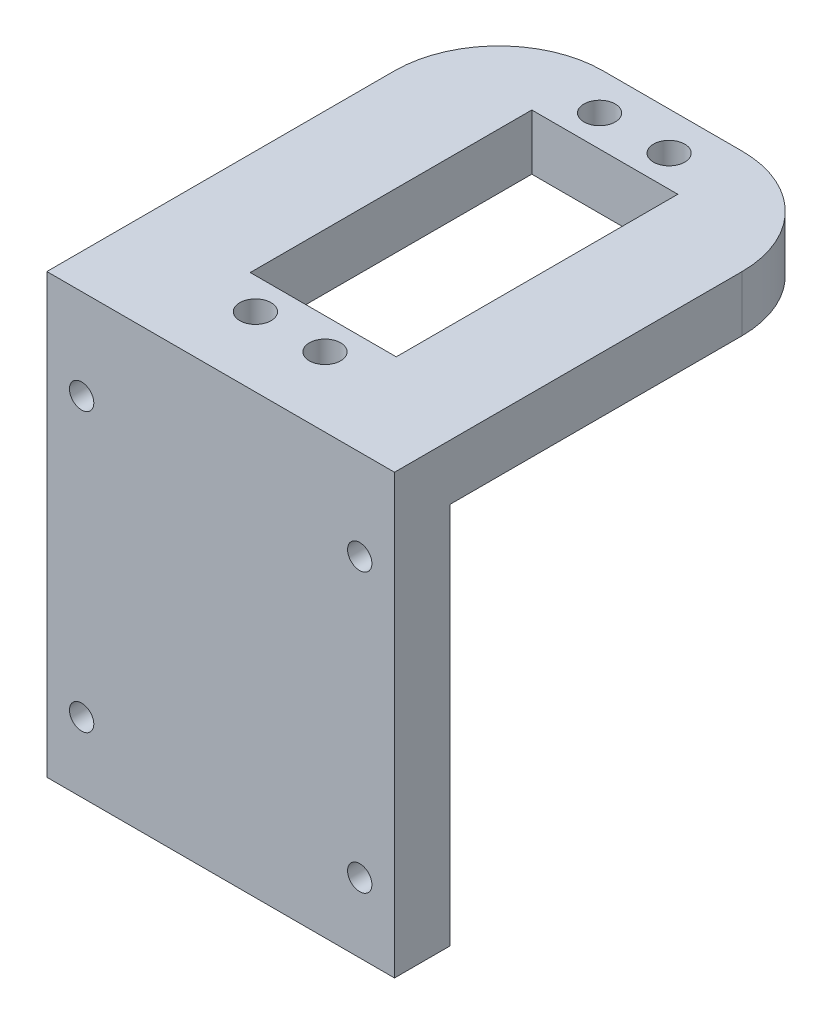
ISO-10303-21;
HEADER;
FILE_DESCRIPTION(('STEP AP214'),'2;1');
FILE_NAME('part.step','',(''),(''),'','','');
FILE_SCHEMA(('AUTOMOTIVE_DESIGN { 1 0 10303 214 1 1 1 1 }'));
ENDSEC;
DATA;
#1=APPLICATION_CONTEXT('core data for automotive mechanical design processes');
#2=APPLICATION_PROTOCOL_DEFINITION('international standard','automotive_design',2000,#1);
#3=PRODUCT_CONTEXT('',#1,'mechanical');
#4=PRODUCT('Part','Part','',(#3));
#5=PRODUCT_RELATED_PRODUCT_CATEGORY('part','',(#4));
#6=PRODUCT_DEFINITION_FORMATION('','',#4);
#7=PRODUCT_DEFINITION_CONTEXT('part definition',#1,'design');
#8=PRODUCT_DEFINITION('design','',#6,#7);
#9=PRODUCT_DEFINITION_SHAPE('','',#8);
#10=(LENGTH_UNIT() NAMED_UNIT(*) SI_UNIT(.MILLI.,.METRE.));
#11=(NAMED_UNIT(*) PLANE_ANGLE_UNIT() SI_UNIT($,.RADIAN.));
#12=(NAMED_UNIT(*) SI_UNIT($,.STERADIAN.) SOLID_ANGLE_UNIT());
#13=UNCERTAINTY_MEASURE_WITH_UNIT(LENGTH_MEASURE(1.E-05),#10,'distance_accuracy_value','');
#14=(GEOMETRIC_REPRESENTATION_CONTEXT(3) GLOBAL_UNCERTAINTY_ASSIGNED_CONTEXT((#13)) GLOBAL_UNIT_ASSIGNED_CONTEXT((#10,
#11,#12)) REPRESENTATION_CONTEXT('',''));
#15=CARTESIAN_POINT('',(0.,0.,0.));
#16=DIRECTION('',(0.,0.,1.));
#17=DIRECTION('',(1.,0.,0.));
#18=AXIS2_PLACEMENT_3D('',#15,#16,#17);
#19=CARTESIAN_POINT('',(20.,-5.,29.5));
#20=DIRECTION('',(0.,0.,-1.));
#21=DIRECTION('',(-1.,0.,0.));
#22=AXIS2_PLACEMENT_3D('',#19,#20,#21);
#23=CYLINDRICAL_SURFACE('',#22,1.75);
#24=CARTESIAN_POINT('',(20.,-5.,27.5));
#25=DIRECTION('',(0.,0.,-1.));
#26=DIRECTION('',(-1.,0.,0.));
#27=AXIS2_PLACEMENT_3D('',#24,#25,#26);
#28=CIRCLE('',#27,1.75);
#29=CARTESIAN_POINT('',(18.25,-5.,27.5));
#30=VERTEX_POINT('',#29);
#31=EDGE_CURVE('E270',#30,#30,#28,.T.);
#32=ORIENTED_EDGE('',*,*,#31,.F.);
#33=EDGE_LOOP('',(#32));
#34=FACE_BOUND('',#33,.T.);
#35=CARTESIAN_POINT('',(20.,-5.,22.5));
#36=DIRECTION('',(0.,0.,-1.));
#37=DIRECTION('',(-1.,0.,0.));
#38=AXIS2_PLACEMENT_3D('',#35,#36,#37);
#39=CIRCLE('',#38,1.75);
#40=CARTESIAN_POINT('',(18.25,-5.,22.5));
#41=VERTEX_POINT('',#40);
#42=EDGE_CURVE('E267',#41,#41,#39,.F.);
#43=ORIENTED_EDGE('',*,*,#42,.F.);
#44=EDGE_LOOP('',(#43));
#45=FACE_BOUND('',#44,.T.);
#46=ADVANCED_FACE('F44',(#34,#45),#23,.F.);
#47=CARTESIAN_POINT('',(-20.,-45.,29.5));
#48=DIRECTION('',(0.,0.,-1.));
#49=DIRECTION('',(-1.,0.,0.));
#50=AXIS2_PLACEMENT_3D('',#47,#48,#49);
#51=CYLINDRICAL_SURFACE('',#50,1.75);
#52=CARTESIAN_POINT('',(-20.,-45.,27.5));
#53=DIRECTION('',(0.,0.,-1.));
#54=DIRECTION('',(-1.,0.,0.));
#55=AXIS2_PLACEMENT_3D('',#52,#53,#54);
#56=CIRCLE('',#55,1.75);
#57=CARTESIAN_POINT('',(-21.75,-45.,27.5));
#58=VERTEX_POINT('',#57);
#59=EDGE_CURVE('E275',#58,#58,#56,.T.);
#60=ORIENTED_EDGE('',*,*,#59,.F.);
#61=EDGE_LOOP('',(#60));
#62=FACE_BOUND('',#61,.T.);
#63=CARTESIAN_POINT('',(-20.,-45.,22.5));
#64=DIRECTION('',(0.,0.,-1.));
#65=DIRECTION('',(-1.,0.,0.));
#66=AXIS2_PLACEMENT_3D('',#63,#64,#65);
#67=CIRCLE('',#66,1.75);
#68=CARTESIAN_POINT('',(-21.75,-45.,22.5));
#69=VERTEX_POINT('',#68);
#70=EDGE_CURVE('E264',#69,#69,#67,.F.);
#71=ORIENTED_EDGE('',*,*,#70,.F.);
#72=EDGE_LOOP('',(#71));
#73=FACE_BOUND('',#72,.T.);
#74=ADVANCED_FACE('F337',(#62,#73),#51,.F.);
#75=CARTESIAN_POINT('',(20.,-45.,29.5));
#76=DIRECTION('',(0.,0.,-1.));
#77=DIRECTION('',(-1.,0.,0.));
#78=AXIS2_PLACEMENT_3D('',#75,#76,#77);
#79=CYLINDRICAL_SURFACE('',#78,1.75);
#80=CARTESIAN_POINT('',(20.,-45.,27.5));
#81=DIRECTION('',(0.,0.,-1.));
#82=DIRECTION('',(-1.,0.,0.));
#83=AXIS2_PLACEMENT_3D('',#80,#81,#82);
#84=CIRCLE('',#83,1.75);
#85=CARTESIAN_POINT('',(18.25,-45.,27.5));
#86=VERTEX_POINT('',#85);
#87=EDGE_CURVE('E281',#86,#86,#84,.T.);
#88=ORIENTED_EDGE('',*,*,#87,.F.);
#89=EDGE_LOOP('',(#88));
#90=FACE_BOUND('',#89,.T.);
#91=CARTESIAN_POINT('',(20.,-45.,22.5));
#92=DIRECTION('',(0.,0.,-1.));
#93=DIRECTION('',(-1.,0.,0.));
#94=AXIS2_PLACEMENT_3D('',#91,#92,#93);
#95=CIRCLE('',#94,1.75);
#96=CARTESIAN_POINT('',(18.25,-45.,22.5));
#97=VERTEX_POINT('',#96);
#98=EDGE_CURVE('E259',#97,#97,#95,.F.);
#99=ORIENTED_EDGE('',*,*,#98,.F.);
#100=EDGE_LOOP('',(#99));
#101=FACE_BOUND('',#100,.T.);
#102=ADVANCED_FACE('F344',(#90,#101),#79,.F.);
#103=CARTESIAN_POINT('',(-20.,-5.,29.5));
#104=DIRECTION('',(0.,0.,-1.));
#105=DIRECTION('',(-1.,0.,0.));
#106=AXIS2_PLACEMENT_3D('',#103,#104,#105);
#107=CYLINDRICAL_SURFACE('',#106,1.75);
#108=CARTESIAN_POINT('',(-20.,-5.,27.5));
#109=DIRECTION('',(0.,0.,-1.));
#110=DIRECTION('',(-1.,0.,0.));
#111=AXIS2_PLACEMENT_3D('',#108,#109,#110);
#112=CIRCLE('',#111,1.75);
#113=CARTESIAN_POINT('',(-21.75,-5.,27.5));
#114=VERTEX_POINT('',#113);
#115=EDGE_CURVE('E290',#114,#114,#112,.T.);
#116=ORIENTED_EDGE('',*,*,#115,.F.);
#117=EDGE_LOOP('',(#116));
#118=FACE_BOUND('',#117,.T.);
#119=CARTESIAN_POINT('',(-20.,-5.,22.5));
#120=DIRECTION('',(0.,0.,-1.));
#121=DIRECTION('',(-1.,0.,0.));
#122=AXIS2_PLACEMENT_3D('',#119,#120,#121);
#123=CIRCLE('',#122,1.75);
#124=CARTESIAN_POINT('',(-21.75,-5.,22.5));
#125=VERTEX_POINT('',#124);
#126=EDGE_CURVE('E255',#125,#125,#123,.F.);
#127=ORIENTED_EDGE('',*,*,#126,.F.);
#128=EDGE_LOOP('',(#127));
#129=FACE_BOUND('',#128,.T.);
#130=ADVANCED_FACE('F364',(#118,#129),#107,.F.);
#131=CARTESIAN_POINT('',(0.,0.,0.));
#132=DIRECTION('',(0.,1.,0.));
#133=DIRECTION('',(0.,0.,1.));
#134=AXIS2_PLACEMENT_3D('',#131,#132,#133);
#135=PLANE('',#134);
#136=CARTESIAN_POINT('',(5.,0.,-32.));
#137=DIRECTION('',(0.,1.,0.));
#138=DIRECTION('',(0.,0.,1.));
#139=AXIS2_PLACEMENT_3D('',#136,#137,#138);
#140=CIRCLE('',#139,2.25);
#141=CARTESIAN_POINT('',(5.,0.,-29.75));
#142=VERTEX_POINT('',#141);
#143=EDGE_CURVE('E650',#142,#142,#140,.T.);
#144=ORIENTED_EDGE('',*,*,#143,.T.);
#145=EDGE_LOOP('',(#144));
#146=FACE_BOUND('',#145,.T.);
#147=CARTESIAN_POINT('',(-5.,0.,-32.));
#148=DIRECTION('',(0.,1.,0.));
#149=DIRECTION('',(0.,0.,1.));
#150=AXIS2_PLACEMENT_3D('',#147,#148,#149);
#151=CIRCLE('',#150,2.25);
#152=CARTESIAN_POINT('',(-5.,0.,-29.75));
#153=VERTEX_POINT('',#152);
#154=EDGE_CURVE('E653',#153,#153,#151,.T.);
#155=ORIENTED_EDGE('',*,*,#154,.T.);
#156=EDGE_LOOP('',(#155));
#157=FACE_BOUND('',#156,.T.);
#158=DIRECTION('',(-1.,0.,0.));
#159=VECTOR('',#158,1.);
#160=CARTESIAN_POINT('',(0.,0.,-27.5));
#161=LINE('',#160,#159);
#162=CARTESIAN_POINT('',(10.75,0.,-27.5));
#163=VERTEX_POINT('',#162);
#164=CARTESIAN_POINT('',(-10.25,0.,-27.5));
#165=VERTEX_POINT('',#164);
#166=EDGE_CURVE('E696',#163,#165,#161,.T.);
#167=ORIENTED_EDGE('',*,*,#166,.T.);
#168=DIRECTION('',(0.,0.,1.));
#169=VECTOR('',#168,1.);
#170=CARTESIAN_POINT('',(-10.25,0.,0.));
#171=LINE('',#170,#169);
#172=CARTESIAN_POINT('',(-10.25,0.,13.));
#173=VERTEX_POINT('',#172);
#174=EDGE_CURVE('E700',#165,#173,#171,.T.);
#175=ORIENTED_EDGE('',*,*,#174,.T.);
#176=DIRECTION('',(1.,0.,0.));
#177=VECTOR('',#176,1.);
#178=CARTESIAN_POINT('',(0.,0.,13.));
#179=LINE('',#178,#177);
#180=CARTESIAN_POINT('',(10.75,0.,13.));
#181=VERTEX_POINT('',#180);
#182=EDGE_CURVE('E679',#173,#181,#179,.T.);
#183=ORIENTED_EDGE('',*,*,#182,.T.);
#184=DIRECTION('',(0.,0.,-1.));
#185=VECTOR('',#184,1.);
#186=CARTESIAN_POINT('',(10.75,0.,0.));
#187=LINE('',#186,#185);
#188=EDGE_CURVE('E692',#181,#163,#187,.T.);
#189=ORIENTED_EDGE('',*,*,#188,.T.);
#190=EDGE_LOOP('',(#167,#175,#183,#189));
#191=FACE_BOUND('',#190,.T.);
#192=DIRECTION('',(0.,0.,1.));
#193=VECTOR('',#192,1.);
#194=CARTESIAN_POINT('',(-25.,0.,-37.5));
#195=LINE('',#194,#193);
#196=CARTESIAN_POINT('',(-25.,0.,-22.5));
#197=VERTEX_POINT('',#196);
#198=CARTESIAN_POINT('',(-25.,0.,19.5));
#199=VERTEX_POINT('',#198);
#200=EDGE_CURVE('E222',#197,#199,#195,.T.);
#201=ORIENTED_EDGE('',*,*,#200,.F.);
#202=CARTESIAN_POINT('',(-10.,0.,-22.5));
#203=DIRECTION('',(0.,1.,0.));
#204=DIRECTION('',(0.,0.,1.));
#205=AXIS2_PLACEMENT_3D('',#202,#203,#204);
#206=CIRCLE('',#205,15.);
#207=CARTESIAN_POINT('',(-10.,0.,-37.5));
#208=VERTEX_POINT('',#207);
#209=EDGE_CURVE('E67',#197,#208,#206,.F.);
#210=ORIENTED_EDGE('',*,*,#209,.T.);
#211=DIRECTION('',(-1.,0.,0.));
#212=VECTOR('',#211,1.);
#213=CARTESIAN_POINT('',(-25.,0.,-37.5));
#214=LINE('',#213,#212);
#215=CARTESIAN_POINT('',(9.99999999999999,0.,-37.5));
#216=VERTEX_POINT('',#215);
#217=EDGE_CURVE('E240',#216,#208,#214,.T.);
#218=ORIENTED_EDGE('',*,*,#217,.F.);
#219=CARTESIAN_POINT('',(9.99999999999999,0.,-22.5));
#220=DIRECTION('',(0.,1.,0.));
#221=DIRECTION('',(0.,0.,1.));
#222=AXIS2_PLACEMENT_3D('',#219,#220,#221);
#223=CIRCLE('',#222,15.);
#224=CARTESIAN_POINT('',(25.,0.,-22.5));
#225=VERTEX_POINT('',#224);
#226=EDGE_CURVE('E202',#216,#225,#223,.F.);
#227=ORIENTED_EDGE('',*,*,#226,.T.);
#228=DIRECTION('',(0.,0.,-1.));
#229=VECTOR('',#228,1.);
#230=CARTESIAN_POINT('',(25.,0.,-37.5));
#231=LINE('',#230,#229);
#232=CARTESIAN_POINT('',(25.,0.,19.5));
#233=VERTEX_POINT('',#232);
#234=EDGE_CURVE('E234',#233,#225,#231,.T.);
#235=ORIENTED_EDGE('',*,*,#234,.F.);
#236=DIRECTION('',(1.,0.,0.));
#237=VECTOR('',#236,1.);
#238=CARTESIAN_POINT('',(-25.,0.,19.5));
#239=LINE('',#238,#237);
#240=CARTESIAN_POINT('',(6.03077640640441,0.,19.5));
#241=VERTEX_POINT('',#240);
#242=EDGE_CURVE('E294',#241,#233,#239,.T.);
#243=ORIENTED_EDGE('',*,*,#242,.F.);
#244=CARTESIAN_POINT('',(5.,0.,17.5));
#245=DIRECTION('',(0.,1.,0.));
#246=DIRECTION('',(0.,0.,1.));
#247=AXIS2_PLACEMENT_3D('',#244,#245,#246);
#248=CIRCLE('',#247,2.25);
#249=CARTESIAN_POINT('',(3.96922359359559,0.,19.5));
#250=VERTEX_POINT('',#249);
#251=EDGE_CURVE('E767',#241,#250,#248,.T.);
#252=ORIENTED_EDGE('',*,*,#251,.T.);
#253=CARTESIAN_POINT('',(-3.9692235935956,0.,19.5));
#254=VERTEX_POINT('',#253);
#255=EDGE_CURVE('E181',#254,#250,#239,.T.);
#256=ORIENTED_EDGE('',*,*,#255,.F.);
#257=CARTESIAN_POINT('',(-5.,0.,17.5));
#258=DIRECTION('',(0.,1.,0.));
#259=DIRECTION('',(0.,0.,1.));
#260=AXIS2_PLACEMENT_3D('',#257,#258,#259);
#261=CIRCLE('',#260,2.25);
#262=CARTESIAN_POINT('',(-6.0307764064044,0.,19.5));
#263=VERTEX_POINT('',#262);
#264=EDGE_CURVE('E660',#254,#263,#261,.T.);
#265=ORIENTED_EDGE('',*,*,#264,.T.);
#266=EDGE_CURVE('E231',#199,#263,#239,.T.);
#267=ORIENTED_EDGE('',*,*,#266,.F.);
#268=EDGE_LOOP('',(#201,#210,#218,#227,#235,#243,#252,#256,#265,#267));
#269=FACE_BOUND('',#268,.T.);
#270=ADVANCED_FACE('F228',(#146,#157,#191,#269),#135,.F.);
#271=CARTESIAN_POINT('',(-25.,8.,-37.5));
#272=DIRECTION('',(1.,0.,0.));
#273=DIRECTION('',(0.,0.,-1.));
#274=AXIS2_PLACEMENT_3D('',#271,#272,#273);
#275=PLANE('',#274);
#276=DIRECTION('',(0.,0.,1.));
#277=VECTOR('',#276,1.);
#278=CARTESIAN_POINT('',(-25.,8.,-37.5));
#279=LINE('',#278,#277);
#280=CARTESIAN_POINT('',(-25.,8.,-22.5));
#281=VERTEX_POINT('',#280);
#282=CARTESIAN_POINT('',(-25.,8.,27.5));
#283=VERTEX_POINT('',#282);
#284=EDGE_CURVE('E225',#281,#283,#279,.T.);
#285=ORIENTED_EDGE('',*,*,#284,.F.);
#286=DIRECTION('',(0.,-1.,0.));
#287=VECTOR('',#286,1.);
#288=CARTESIAN_POINT('',(-25.,8.,-22.5));
#289=LINE('',#288,#287);
#290=EDGE_CURVE('E211',#281,#197,#289,.T.);
#291=ORIENTED_EDGE('',*,*,#290,.T.);
#292=ORIENTED_EDGE('',*,*,#200,.T.);
#293=DIRECTION('',(0.,1.,0.));
#294=VECTOR('',#293,1.);
#295=CARTESIAN_POINT('',(-25.,-55.,19.5));
#296=LINE('',#295,#294);
#297=CARTESIAN_POINT('',(-25.,-55.,19.5));
#298=VERTEX_POINT('',#297);
#299=EDGE_CURVE('E235',#298,#199,#296,.T.);
#300=ORIENTED_EDGE('',*,*,#299,.F.);
#301=DIRECTION('',(0.,0.,-1.));
#302=VECTOR('',#301,1.);
#303=CARTESIAN_POINT('',(-25.,-55.,27.5));
#304=LINE('',#303,#302);
#305=CARTESIAN_POINT('',(-25.,-55.,27.5));
#306=VERTEX_POINT('',#305);
#307=EDGE_CURVE('E295',#306,#298,#304,.T.);
#308=ORIENTED_EDGE('',*,*,#307,.F.);
#309=DIRECTION('',(0.,-1.,0.));
#310=VECTOR('',#309,1.);
#311=CARTESIAN_POINT('',(-25.,8.,27.5));
#312=LINE('',#311,#310);
#313=EDGE_CURVE('E167',#283,#306,#312,.T.);
#314=ORIENTED_EDGE('',*,*,#313,.F.);
#315=EDGE_LOOP('',(#285,#291,#292,#300,#308,#314));
#316=FACE_BOUND('',#315,.T.);
#317=ADVANCED_FACE('F220',(#316),#275,.F.);
#318=CARTESIAN_POINT('',(-25.,8.,27.5));
#319=DIRECTION('',(0.,0.,-1.));
#320=DIRECTION('',(-1.,0.,0.));
#321=AXIS2_PLACEMENT_3D('',#318,#319,#320);
#322=PLANE('',#321);
#323=ORIENTED_EDGE('',*,*,#115,.T.);
#324=EDGE_LOOP('',(#323));
#325=FACE_BOUND('',#324,.T.);
#326=ORIENTED_EDGE('',*,*,#87,.T.);
#327=EDGE_LOOP('',(#326));
#328=FACE_BOUND('',#327,.T.);
#329=ORIENTED_EDGE('',*,*,#59,.T.);
#330=EDGE_LOOP('',(#329));
#331=FACE_BOUND('',#330,.T.);
#332=ORIENTED_EDGE('',*,*,#31,.T.);
#333=EDGE_LOOP('',(#332));
#334=FACE_BOUND('',#333,.T.);
#335=ORIENTED_EDGE('',*,*,#313,.T.);
#336=DIRECTION('',(-1.,0.,0.));
#337=VECTOR('',#336,1.);
#338=CARTESIAN_POINT('',(-25.,-55.,27.5));
#339=LINE('',#338,#337);
#340=CARTESIAN_POINT('',(25.,-55.,27.5));
#341=VERTEX_POINT('',#340);
#342=EDGE_CURVE('E306',#341,#306,#339,.T.);
#343=ORIENTED_EDGE('',*,*,#342,.F.);
#344=DIRECTION('',(0.,-1.,0.));
#345=VECTOR('',#344,1.);
#346=CARTESIAN_POINT('',(25.,8.,27.5));
#347=LINE('',#346,#345);
#348=CARTESIAN_POINT('',(25.,8.,27.5));
#349=VERTEX_POINT('',#348);
#350=EDGE_CURVE('E250',#349,#341,#347,.T.);
#351=ORIENTED_EDGE('',*,*,#350,.F.);
#352=DIRECTION('',(1.,0.,0.));
#353=VECTOR('',#352,1.);
#354=CARTESIAN_POINT('',(-25.,8.,27.5));
#355=LINE('',#354,#353);
#356=EDGE_CURVE('E317',#283,#349,#355,.T.);
#357=ORIENTED_EDGE('',*,*,#356,.F.);
#358=EDGE_LOOP('',(#335,#343,#351,#357));
#359=FACE_BOUND('',#358,.T.);
#360=ADVANCED_FACE('F371',(#325,#328,#331,#334,#359),#322,.F.);
#361=CARTESIAN_POINT('',(25.,8.,-37.5));
#362=DIRECTION('',(-1.,0.,0.));
#363=DIRECTION('',(0.,0.,1.));
#364=AXIS2_PLACEMENT_3D('',#361,#362,#363);
#365=PLANE('',#364);
#366=ORIENTED_EDGE('',*,*,#234,.T.);
#367=DIRECTION('',(0.,-1.,0.));
#368=VECTOR('',#367,1.);
#369=CARTESIAN_POINT('',(25.,8.,-22.5));
#370=LINE('',#369,#368);
#371=CARTESIAN_POINT('',(25.,8.,-22.5));
#372=VERTEX_POINT('',#371);
#373=EDGE_CURVE('E205',#225,#372,#370,.F.);
#374=ORIENTED_EDGE('',*,*,#373,.T.);
#375=DIRECTION('',(0.,0.,-1.));
#376=VECTOR('',#375,1.);
#377=CARTESIAN_POINT('',(25.,8.,-37.5));
#378=LINE('',#377,#376);
#379=EDGE_CURVE('E319',#349,#372,#378,.T.);
#380=ORIENTED_EDGE('',*,*,#379,.F.);
#381=ORIENTED_EDGE('',*,*,#350,.T.);
#382=DIRECTION('',(0.,0.,1.));
#383=VECTOR('',#382,1.);
#384=CARTESIAN_POINT('',(25.,-55.,27.5));
#385=LINE('',#384,#383);
#386=CARTESIAN_POINT('',(25.,-55.,19.5));
#387=VERTEX_POINT('',#386);
#388=EDGE_CURVE('E302',#387,#341,#385,.T.);
#389=ORIENTED_EDGE('',*,*,#388,.F.);
#390=DIRECTION('',(0.,1.,0.));
#391=VECTOR('',#390,1.);
#392=CARTESIAN_POINT('',(25.,-55.,19.5));
#393=LINE('',#392,#391);
#394=EDGE_CURVE('E242',#387,#233,#393,.T.);
#395=ORIENTED_EDGE('',*,*,#394,.T.);
#396=EDGE_LOOP('',(#366,#374,#380,#381,#389,#395));
#397=FACE_BOUND('',#396,.T.);
#398=ADVANCED_FACE('F368',(#397),#365,.F.);
#399=CARTESIAN_POINT('',(-25.,8.,-37.5));
#400=DIRECTION('',(0.,0.,1.));
#401=DIRECTION('',(1.,0.,0.));
#402=AXIS2_PLACEMENT_3D('',#399,#400,#401);
#403=PLANE('',#402);
#404=ORIENTED_EDGE('',*,*,#217,.T.);
#405=DIRECTION('',(0.,-1.,0.));
#406=VECTOR('',#405,1.);
#407=CARTESIAN_POINT('',(-10.,8.,-37.5));
#408=LINE('',#407,#406);
#409=CARTESIAN_POINT('',(-10.,8.,-37.5));
#410=VERTEX_POINT('',#409);
#411=EDGE_CURVE('E53',#208,#410,#408,.F.);
#412=ORIENTED_EDGE('',*,*,#411,.T.);
#413=DIRECTION('',(-1.,0.,0.));
#414=VECTOR('',#413,1.);
#415=CARTESIAN_POINT('',(-25.,8.,-37.5));
#416=LINE('',#415,#414);
#417=CARTESIAN_POINT('',(9.99999999999999,8.,-37.5));
#418=VERTEX_POINT('',#417);
#419=EDGE_CURVE('E245',#418,#410,#416,.T.);
#420=ORIENTED_EDGE('',*,*,#419,.F.);
#421=DIRECTION('',(0.,-1.,0.));
#422=VECTOR('',#421,1.);
#423=CARTESIAN_POINT('',(9.99999999999999,8.,-37.5));
#424=LINE('',#423,#422);
#425=EDGE_CURVE('E198',#418,#216,#424,.T.);
#426=ORIENTED_EDGE('',*,*,#425,.T.);
#427=EDGE_LOOP('',(#404,#412,#420,#426));
#428=FACE_BOUND('',#427,.T.);
#429=ADVANCED_FACE('F360',(#428),#403,.F.);
#430=CARTESIAN_POINT('',(0.,8.,0.));
#431=DIRECTION('',(0.,1.,0.));
#432=DIRECTION('',(0.,0.,1.));
#433=AXIS2_PLACEMENT_3D('',#430,#431,#432);
#434=PLANE('',#433);
#435=CARTESIAN_POINT('',(5.,8.,-32.));
#436=DIRECTION('',(0.,1.,0.));
#437=DIRECTION('',(0.,0.,1.));
#438=AXIS2_PLACEMENT_3D('',#435,#436,#437);
#439=CIRCLE('',#438,2.25);
#440=CARTESIAN_POINT('',(5.,8.,-29.75));
#441=VERTEX_POINT('',#440);
#442=EDGE_CURVE('E647',#441,#441,#439,.T.);
#443=ORIENTED_EDGE('',*,*,#442,.F.);
#444=EDGE_LOOP('',(#443));
#445=FACE_BOUND('',#444,.T.);
#446=CARTESIAN_POINT('',(-5.,8.,17.5));
#447=DIRECTION('',(0.,1.,0.));
#448=DIRECTION('',(0.,0.,1.));
#449=AXIS2_PLACEMENT_3D('',#446,#447,#448);
#450=CIRCLE('',#449,2.25);
#451=CARTESIAN_POINT('',(-5.,8.,19.75));
#452=VERTEX_POINT('',#451);
#453=EDGE_CURVE('E777',#452,#452,#450,.T.);
#454=ORIENTED_EDGE('',*,*,#453,.F.);
#455=EDGE_LOOP('',(#454));
#456=FACE_BOUND('',#455,.T.);
#457=CARTESIAN_POINT('',(5.,8.,17.5));
#458=DIRECTION('',(0.,1.,0.));
#459=DIRECTION('',(0.,0.,1.));
#460=AXIS2_PLACEMENT_3D('',#457,#458,#459);
#461=CIRCLE('',#460,2.25);
#462=CARTESIAN_POINT('',(5.,8.,19.75));
#463=VERTEX_POINT('',#462);
#464=EDGE_CURVE('E174',#463,#463,#461,.T.);
#465=ORIENTED_EDGE('',*,*,#464,.F.);
#466=EDGE_LOOP('',(#465));
#467=FACE_BOUND('',#466,.T.);
#468=CARTESIAN_POINT('',(-5.,8.,-32.));
#469=DIRECTION('',(0.,1.,0.));
#470=DIRECTION('',(0.,0.,1.));
#471=AXIS2_PLACEMENT_3D('',#468,#469,#470);
#472=CIRCLE('',#471,2.25);
#473=CARTESIAN_POINT('',(-5.,8.,-29.75));
#474=VERTEX_POINT('',#473);
#475=EDGE_CURVE('E770',#474,#474,#472,.T.);
#476=ORIENTED_EDGE('',*,*,#475,.F.);
#477=EDGE_LOOP('',(#476));
#478=FACE_BOUND('',#477,.T.);
#479=DIRECTION('',(0.,0.,1.));
#480=VECTOR('',#479,1.);
#481=CARTESIAN_POINT('',(-10.25,8.,-27.5));
#482=LINE('',#481,#480);
#483=CARTESIAN_POINT('',(-10.25,8.,-27.5));
#484=VERTEX_POINT('',#483);
#485=CARTESIAN_POINT('',(-10.25,8.,13.));
#486=VERTEX_POINT('',#485);
#487=EDGE_CURVE('E652',#484,#486,#482,.T.);
#488=ORIENTED_EDGE('',*,*,#487,.F.);
#489=DIRECTION('',(-1.,0.,0.));
#490=VECTOR('',#489,1.);
#491=CARTESIAN_POINT('',(-10.25,8.,-27.5));
#492=LINE('',#491,#490);
#493=CARTESIAN_POINT('',(10.75,8.,-27.5));
#494=VERTEX_POINT('',#493);
#495=EDGE_CURVE('E671',#494,#484,#492,.T.);
#496=ORIENTED_EDGE('',*,*,#495,.F.);
#497=DIRECTION('',(0.,0.,-1.));
#498=VECTOR('',#497,1.);
#499=CARTESIAN_POINT('',(10.75,8.,-27.5));
#500=LINE('',#499,#498);
#501=CARTESIAN_POINT('',(10.75,8.,13.));
#502=VERTEX_POINT('',#501);
#503=EDGE_CURVE('E667',#502,#494,#500,.T.);
#504=ORIENTED_EDGE('',*,*,#503,.F.);
#505=DIRECTION('',(1.,0.,0.));
#506=VECTOR('',#505,1.);
#507=CARTESIAN_POINT('',(-10.25,8.,13.));
#508=LINE('',#507,#506);
#509=EDGE_CURVE('E657',#486,#502,#508,.T.);
#510=ORIENTED_EDGE('',*,*,#509,.F.);
#511=EDGE_LOOP('',(#488,#496,#504,#510));
#512=FACE_BOUND('',#511,.T.);
#513=ORIENTED_EDGE('',*,*,#419,.T.);
#514=CARTESIAN_POINT('',(-10.,8.,-22.5));
#515=DIRECTION('',(0.,1.,0.));
#516=DIRECTION('',(0.,0.,1.));
#517=AXIS2_PLACEMENT_3D('',#514,#515,#516);
#518=CIRCLE('',#517,15.);
#519=EDGE_CURVE('E11',#410,#281,#518,.T.);
#520=ORIENTED_EDGE('',*,*,#519,.T.);
#521=ORIENTED_EDGE('',*,*,#284,.T.);
#522=ORIENTED_EDGE('',*,*,#356,.T.);
#523=ORIENTED_EDGE('',*,*,#379,.T.);
#524=CARTESIAN_POINT('',(9.99999999999999,8.,-22.5));
#525=DIRECTION('',(0.,1.,0.));
#526=DIRECTION('',(0.,0.,1.));
#527=AXIS2_PLACEMENT_3D('',#524,#525,#526);
#528=CIRCLE('',#527,15.);
#529=EDGE_CURVE('E208',#372,#418,#528,.T.);
#530=ORIENTED_EDGE('',*,*,#529,.T.);
#531=EDGE_LOOP('',(#513,#520,#521,#522,#523,#530));
#532=FACE_BOUND('',#531,.T.);
#533=ADVANCED_FACE('F326',(#445,#456,#467,#478,#512,#532),#434,.T.);
#534=CARTESIAN_POINT('',(-25.,-55.,19.5));
#535=DIRECTION('',(0.,0.,1.));
#536=DIRECTION('',(1.,0.,0.));
#537=AXIS2_PLACEMENT_3D('',#534,#535,#536);
#538=PLANE('',#537);
#539=CARTESIAN_POINT('',(20.,-45.,19.5));
#540=DIRECTION('',(0.,0.,-1.));
#541=DIRECTION('',(-1.,0.,0.));
#542=AXIS2_PLACEMENT_3D('',#539,#540,#541);
#543=CIRCLE('',#542,3.5);
#544=CARTESIAN_POINT('',(16.5,-45.,19.5));
#545=VERTEX_POINT('',#544);
#546=EDGE_CURVE('E721',#545,#545,#543,.T.);
#547=ORIENTED_EDGE('',*,*,#546,.F.);
#548=EDGE_LOOP('',(#547));
#549=FACE_BOUND('',#548,.T.);
#550=CARTESIAN_POINT('',(-20.,-45.,19.5));
#551=DIRECTION('',(0.,0.,-1.));
#552=DIRECTION('',(-1.,0.,0.));
#553=AXIS2_PLACEMENT_3D('',#550,#551,#552);
#554=CIRCLE('',#553,3.5);
#555=CARTESIAN_POINT('',(-23.5,-45.,19.5));
#556=VERTEX_POINT('',#555);
#557=EDGE_CURVE('E713',#556,#556,#554,.T.);
#558=ORIENTED_EDGE('',*,*,#557,.F.);
#559=EDGE_LOOP('',(#558));
#560=FACE_BOUND('',#559,.T.);
#561=CARTESIAN_POINT('',(-20.,-5.,19.5));
#562=DIRECTION('',(0.,0.,-1.));
#563=DIRECTION('',(-1.,0.,0.));
#564=AXIS2_PLACEMENT_3D('',#561,#562,#563);
#565=CIRCLE('',#564,3.5);
#566=CARTESIAN_POINT('',(-23.5,-5.,19.5));
#567=VERTEX_POINT('',#566);
#568=EDGE_CURVE('E705',#567,#567,#565,.T.);
#569=ORIENTED_EDGE('',*,*,#568,.F.);
#570=EDGE_LOOP('',(#569));
#571=FACE_BOUND('',#570,.T.);
#572=CARTESIAN_POINT('',(20.,-5.,19.5));
#573=DIRECTION('',(0.,0.,-1.));
#574=DIRECTION('',(-1.,0.,0.));
#575=AXIS2_PLACEMENT_3D('',#572,#573,#574);
#576=CIRCLE('',#575,3.5);
#577=CARTESIAN_POINT('',(16.5,-5.,19.5));
#578=VERTEX_POINT('',#577);
#579=EDGE_CURVE('E284',#578,#578,#576,.T.);
#580=ORIENTED_EDGE('',*,*,#579,.F.);
#581=EDGE_LOOP('',(#580));
#582=FACE_BOUND('',#581,.T.);
#583=DIRECTION('',(-1.,0.,0.));
#584=VECTOR('',#583,1.);
#585=CARTESIAN_POINT('',(-25.,-2.,19.5));
#586=LINE('',#585,#584);
#587=CARTESIAN_POINT('',(-3.9692235935956,-2.,19.5));
#588=VERTEX_POINT('',#587);
#589=CARTESIAN_POINT('',(-6.0307764064044,-2.,19.5));
#590=VERTEX_POINT('',#589);
#591=EDGE_CURVE('E185',#588,#590,#586,.T.);
#592=ORIENTED_EDGE('',*,*,#591,.F.);
#593=DIRECTION('',(0.,1.,0.));
#594=VECTOR('',#593,1.);
#595=CARTESIAN_POINT('',(-3.9692235935956,-2.,19.5));
#596=LINE('',#595,#594);
#597=EDGE_CURVE('E195',#588,#254,#596,.T.);
#598=ORIENTED_EDGE('',*,*,#597,.T.);
#599=ORIENTED_EDGE('',*,*,#255,.T.);
#600=DIRECTION('',(0.,1.,0.));
#601=VECTOR('',#600,1.);
#602=CARTESIAN_POINT('',(3.96922359359559,-2.,19.5));
#603=LINE('',#602,#601);
#604=CARTESIAN_POINT('',(3.96922359359559,-2.,19.5));
#605=VERTEX_POINT('',#604);
#606=EDGE_CURVE('E166',#250,#605,#603,.F.);
#607=ORIENTED_EDGE('',*,*,#606,.T.);
#608=DIRECTION('',(-1.,0.,0.));
#609=VECTOR('',#608,1.);
#610=CARTESIAN_POINT('',(-25.,-2.,19.5));
#611=LINE('',#610,#609);
#612=CARTESIAN_POINT('',(6.03077640640441,-2.,19.5));
#613=VERTEX_POINT('',#612);
#614=EDGE_CURVE('E157',#613,#605,#611,.T.);
#615=ORIENTED_EDGE('',*,*,#614,.F.);
#616=DIRECTION('',(0.,1.,0.));
#617=VECTOR('',#616,1.);
#618=CARTESIAN_POINT('',(6.03077640640441,-2.,19.5));
#619=LINE('',#618,#617);
#620=EDGE_CURVE('E172',#613,#241,#619,.T.);
#621=ORIENTED_EDGE('',*,*,#620,.T.);
#622=ORIENTED_EDGE('',*,*,#242,.T.);
#623=ORIENTED_EDGE('',*,*,#394,.F.);
#624=DIRECTION('',(1.,0.,0.));
#625=VECTOR('',#624,1.);
#626=CARTESIAN_POINT('',(-25.,-55.,19.5));
#627=LINE('',#626,#625);
#628=EDGE_CURVE('E299',#298,#387,#627,.T.);
#629=ORIENTED_EDGE('',*,*,#628,.F.);
#630=ORIENTED_EDGE('',*,*,#299,.T.);
#631=ORIENTED_EDGE('',*,*,#266,.T.);
#632=DIRECTION('',(0.,1.,0.));
#633=VECTOR('',#632,1.);
#634=CARTESIAN_POINT('',(-6.0307764064044,-2.,19.5));
#635=LINE('',#634,#633);
#636=EDGE_CURVE('E191',#263,#590,#635,.F.);
#637=ORIENTED_EDGE('',*,*,#636,.T.);
#638=EDGE_LOOP('',(#592,#598,#599,#607,#615,#621,#622,#623,#629,#630,#631,#637));
#639=FACE_BOUND('',#638,.T.);
#640=ADVANCED_FACE('F178',(#549,#560,#571,#582,#639),#538,.F.);
#641=CARTESIAN_POINT('',(0.,-55.,0.));
#642=DIRECTION('',(0.,-1.,0.));
#643=DIRECTION('',(0.,0.,-1.));
#644=AXIS2_PLACEMENT_3D('',#641,#642,#643);
#645=PLANE('',#644);
#646=ORIENTED_EDGE('',*,*,#307,.T.);
#647=ORIENTED_EDGE('',*,*,#628,.T.);
#648=ORIENTED_EDGE('',*,*,#388,.T.);
#649=ORIENTED_EDGE('',*,*,#342,.T.);
#650=EDGE_LOOP('',(#646,#647,#648,#649));
#651=FACE_BOUND('',#650,.T.);
#652=ADVANCED_FACE('F351',(#651),#645,.T.);
#653=CARTESIAN_POINT('',(-20.,-5.,22.5));
#654=DIRECTION('',(0.,0.,-1.));
#655=DIRECTION('',(-1.,0.,0.));
#656=AXIS2_PLACEMENT_3D('',#653,#654,#655);
#657=PLANE('',#656);
#658=CARTESIAN_POINT('',(-20.,-5.,22.5));
#659=DIRECTION('',(0.,0.,-1.));
#660=DIRECTION('',(-1.,0.,0.));
#661=AXIS2_PLACEMENT_3D('',#658,#659,#660);
#662=CIRCLE('',#661,3.5);
#663=CARTESIAN_POINT('',(-23.5,-5.,22.5));
#664=VERTEX_POINT('',#663);
#665=EDGE_CURVE('E709',#664,#664,#662,.T.);
#666=ORIENTED_EDGE('',*,*,#665,.T.);
#667=EDGE_LOOP('',(#666));
#668=FACE_BOUND('',#667,.T.);
#669=ORIENTED_EDGE('',*,*,#126,.T.);
#670=EDGE_LOOP('',(#669));
#671=FACE_BOUND('',#670,.T.);
#672=ADVANCED_FACE('F354',(#668,#671),#657,.T.);
#673=CARTESIAN_POINT('',(-20.,-5.,22.5));
#674=DIRECTION('',(0.,0.,-1.));
#675=DIRECTION('',(-1.,0.,0.));
#676=AXIS2_PLACEMENT_3D('',#673,#674,#675);
#677=CYLINDRICAL_SURFACE('',#676,3.5);
#678=ORIENTED_EDGE('',*,*,#665,.F.);
#679=EDGE_LOOP('',(#678));
#680=FACE_BOUND('',#679,.T.);
#681=ORIENTED_EDGE('',*,*,#568,.T.);
#682=EDGE_LOOP('',(#681));
#683=FACE_BOUND('',#682,.T.);
#684=ADVANCED_FACE('F442',(#680,#683),#677,.F.);
#685=CARTESIAN_POINT('',(20.,-45.,22.5));
#686=DIRECTION('',(0.,0.,-1.));
#687=DIRECTION('',(-1.,0.,0.));
#688=AXIS2_PLACEMENT_3D('',#685,#686,#687);
#689=PLANE('',#688);
#690=CARTESIAN_POINT('',(20.,-45.,22.5));
#691=DIRECTION('',(0.,0.,-1.));
#692=DIRECTION('',(-1.,0.,0.));
#693=AXIS2_PLACEMENT_3D('',#690,#691,#692);
#694=CIRCLE('',#693,3.5);
#695=CARTESIAN_POINT('',(16.5,-45.,22.5));
#696=VERTEX_POINT('',#695);
#697=EDGE_CURVE('E704',#696,#696,#694,.T.);
#698=ORIENTED_EDGE('',*,*,#697,.T.);
#699=EDGE_LOOP('',(#698));
#700=FACE_BOUND('',#699,.T.);
#701=ORIENTED_EDGE('',*,*,#98,.T.);
#702=EDGE_LOOP('',(#701));
#703=FACE_BOUND('',#702,.T.);
#704=ADVANCED_FACE('F451',(#700,#703),#689,.T.);
#705=CARTESIAN_POINT('',(20.,-45.,22.5));
#706=DIRECTION('',(0.,0.,-1.));
#707=DIRECTION('',(-1.,0.,0.));
#708=AXIS2_PLACEMENT_3D('',#705,#706,#707);
#709=CYLINDRICAL_SURFACE('',#708,3.5);
#710=ORIENTED_EDGE('',*,*,#697,.F.);
#711=EDGE_LOOP('',(#710));
#712=FACE_BOUND('',#711,.T.);
#713=ORIENTED_EDGE('',*,*,#546,.T.);
#714=EDGE_LOOP('',(#713));
#715=FACE_BOUND('',#714,.T.);
#716=ADVANCED_FACE('F460',(#712,#715),#709,.F.);
#717=CARTESIAN_POINT('',(-20.,-45.,22.5));
#718=DIRECTION('',(0.,0.,-1.));
#719=DIRECTION('',(-1.,0.,0.));
#720=AXIS2_PLACEMENT_3D('',#717,#718,#719);
#721=PLANE('',#720);
#722=CARTESIAN_POINT('',(-20.,-45.,22.5));
#723=DIRECTION('',(0.,0.,-1.));
#724=DIRECTION('',(-1.,0.,0.));
#725=AXIS2_PLACEMENT_3D('',#722,#723,#724);
#726=CIRCLE('',#725,3.5);
#727=CARTESIAN_POINT('',(-23.5,-45.,22.5));
#728=VERTEX_POINT('',#727);
#729=EDGE_CURVE('E717',#728,#728,#726,.T.);
#730=ORIENTED_EDGE('',*,*,#729,.T.);
#731=EDGE_LOOP('',(#730));
#732=FACE_BOUND('',#731,.T.);
#733=ORIENTED_EDGE('',*,*,#70,.T.);
#734=EDGE_LOOP('',(#733));
#735=FACE_BOUND('',#734,.T.);
#736=ADVANCED_FACE('F469',(#732,#735),#721,.T.);
#737=CARTESIAN_POINT('',(-20.,-45.,22.5));
#738=DIRECTION('',(0.,0.,-1.));
#739=DIRECTION('',(-1.,0.,0.));
#740=AXIS2_PLACEMENT_3D('',#737,#738,#739);
#741=CYLINDRICAL_SURFACE('',#740,3.5);
#742=ORIENTED_EDGE('',*,*,#729,.F.);
#743=EDGE_LOOP('',(#742));
#744=FACE_BOUND('',#743,.T.);
#745=ORIENTED_EDGE('',*,*,#557,.T.);
#746=EDGE_LOOP('',(#745));
#747=FACE_BOUND('',#746,.T.);
#748=ADVANCED_FACE('F478',(#744,#747),#741,.F.);
#749=CARTESIAN_POINT('',(20.,-5.,22.5));
#750=DIRECTION('',(0.,0.,-1.));
#751=DIRECTION('',(-1.,0.,0.));
#752=AXIS2_PLACEMENT_3D('',#749,#750,#751);
#753=PLANE('',#752);
#754=CARTESIAN_POINT('',(20.,-5.,22.5));
#755=DIRECTION('',(0.,0.,-1.));
#756=DIRECTION('',(-1.,0.,0.));
#757=AXIS2_PLACEMENT_3D('',#754,#755,#756);
#758=CIRCLE('',#757,3.5);
#759=CARTESIAN_POINT('',(16.5,-5.,22.5));
#760=VERTEX_POINT('',#759);
#761=EDGE_CURVE('E260',#760,#760,#758,.T.);
#762=ORIENTED_EDGE('',*,*,#761,.T.);
#763=EDGE_LOOP('',(#762));
#764=FACE_BOUND('',#763,.T.);
#765=ORIENTED_EDGE('',*,*,#42,.T.);
#766=EDGE_LOOP('',(#765));
#767=FACE_BOUND('',#766,.T.);
#768=ADVANCED_FACE('F487',(#764,#767),#753,.T.);
#769=CARTESIAN_POINT('',(20.,-5.,22.5));
#770=DIRECTION('',(0.,0.,-1.));
#771=DIRECTION('',(-1.,0.,0.));
#772=AXIS2_PLACEMENT_3D('',#769,#770,#771);
#773=CYLINDRICAL_SURFACE('',#772,3.5);
#774=ORIENTED_EDGE('',*,*,#761,.F.);
#775=EDGE_LOOP('',(#774));
#776=FACE_BOUND('',#775,.T.);
#777=ORIENTED_EDGE('',*,*,#579,.T.);
#778=EDGE_LOOP('',(#777));
#779=FACE_BOUND('',#778,.T.);
#780=ADVANCED_FACE('F496',(#776,#779),#773,.F.);
#781=CARTESIAN_POINT('',(-10.25,-2.,-27.5));
#782=DIRECTION('',(-1.,0.,0.));
#783=DIRECTION('',(0.,0.,1.));
#784=AXIS2_PLACEMENT_3D('',#781,#782,#783);
#785=PLANE('',#784);
#786=DIRECTION('',(0.,1.,0.));
#787=VECTOR('',#786,1.);
#788=CARTESIAN_POINT('',(-10.25,-2.,-27.5));
#789=LINE('',#788,#787);
#790=EDGE_CURVE('E676',#165,#484,#789,.T.);
#791=ORIENTED_EDGE('',*,*,#790,.T.);
#792=ORIENTED_EDGE('',*,*,#487,.T.);
#793=DIRECTION('',(0.,1.,0.));
#794=VECTOR('',#793,1.);
#795=CARTESIAN_POINT('',(-10.25,-2.,13.));
#796=LINE('',#795,#794);
#797=EDGE_CURVE('E675',#173,#486,#796,.T.);
#798=ORIENTED_EDGE('',*,*,#797,.F.);
#799=ORIENTED_EDGE('',*,*,#174,.F.);
#800=EDGE_LOOP('',(#791,#792,#798,#799));
#801=FACE_BOUND('',#800,.T.);
#802=ADVANCED_FACE('F505',(#801),#785,.F.);
#803=CARTESIAN_POINT('',(-10.25,-2.,-27.5));
#804=DIRECTION('',(0.,0.,-1.));
#805=DIRECTION('',(-1.,0.,0.));
#806=AXIS2_PLACEMENT_3D('',#803,#804,#805);
#807=PLANE('',#806);
#808=DIRECTION('',(0.,1.,0.));
#809=VECTOR('',#808,1.);
#810=CARTESIAN_POINT('',(10.75,-2.,-27.5));
#811=LINE('',#810,#809);
#812=EDGE_CURVE('E680',#163,#494,#811,.T.);
#813=ORIENTED_EDGE('',*,*,#812,.T.);
#814=ORIENTED_EDGE('',*,*,#495,.T.);
#815=ORIENTED_EDGE('',*,*,#790,.F.);
#816=ORIENTED_EDGE('',*,*,#166,.F.);
#817=EDGE_LOOP('',(#813,#814,#815,#816));
#818=FACE_BOUND('',#817,.T.);
#819=ADVANCED_FACE('F514',(#818),#807,.F.);
#820=CARTESIAN_POINT('',(10.75,-2.,-27.5));
#821=DIRECTION('',(1.,0.,0.));
#822=DIRECTION('',(0.,0.,-1.));
#823=AXIS2_PLACEMENT_3D('',#820,#821,#822);
#824=PLANE('',#823);
#825=DIRECTION('',(0.,1.,0.));
#826=VECTOR('',#825,1.);
#827=CARTESIAN_POINT('',(10.75,-2.,13.));
#828=LINE('',#827,#826);
#829=EDGE_CURVE('E683',#181,#502,#828,.T.);
#830=ORIENTED_EDGE('',*,*,#829,.T.);
#831=ORIENTED_EDGE('',*,*,#503,.T.);
#832=ORIENTED_EDGE('',*,*,#812,.F.);
#833=ORIENTED_EDGE('',*,*,#188,.F.);
#834=EDGE_LOOP('',(#830,#831,#832,#833));
#835=FACE_BOUND('',#834,.T.);
#836=ADVANCED_FACE('F523',(#835),#824,.F.);
#837=CARTESIAN_POINT('',(-10.25,-2.,13.));
#838=DIRECTION('',(0.,0.,1.));
#839=DIRECTION('',(1.,0.,0.));
#840=AXIS2_PLACEMENT_3D('',#837,#838,#839);
#841=PLANE('',#840);
#842=ORIENTED_EDGE('',*,*,#797,.T.);
#843=ORIENTED_EDGE('',*,*,#509,.T.);
#844=ORIENTED_EDGE('',*,*,#829,.F.);
#845=ORIENTED_EDGE('',*,*,#182,.F.);
#846=EDGE_LOOP('',(#842,#843,#844,#845));
#847=FACE_BOUND('',#846,.T.);
#848=ADVANCED_FACE('F532',(#847),#841,.F.);
#849=CARTESIAN_POINT('',(5.,-2.,17.5));
#850=DIRECTION('',(0.,1.,0.));
#851=DIRECTION('',(0.,0.,1.));
#852=AXIS2_PLACEMENT_3D('',#849,#850,#851);
#853=CYLINDRICAL_SURFACE('',#852,2.25);
#854=ORIENTED_EDGE('',*,*,#464,.T.);
#855=EDGE_LOOP('',(#854));
#856=FACE_BOUND('',#855,.T.);
#857=CARTESIAN_POINT('',(5.,-2.,17.5));
#858=DIRECTION('',(0.,1.,0.));
#859=DIRECTION('',(0.,0.,1.));
#860=AXIS2_PLACEMENT_3D('',#857,#858,#859);
#861=CIRCLE('',#860,2.25);
#862=EDGE_CURVE('E160',#605,#613,#861,.T.);
#863=ORIENTED_EDGE('',*,*,#862,.F.);
#864=ORIENTED_EDGE('',*,*,#606,.F.);
#865=ORIENTED_EDGE('',*,*,#251,.F.);
#866=ORIENTED_EDGE('',*,*,#620,.F.);
#867=EDGE_LOOP('',(#863,#864,#865,#866));
#868=FACE_BOUND('',#867,.T.);
#869=ADVANCED_FACE('F170',(#856,#868),#853,.F.);
#870=CARTESIAN_POINT('',(5.,-2.,17.5));
#871=DIRECTION('',(0.,1.,0.));
#872=DIRECTION('',(0.,0.,1.));
#873=AXIS2_PLACEMENT_3D('',#870,#871,#872);
#874=PLANE('',#873);
#875=ORIENTED_EDGE('',*,*,#614,.T.);
#876=ORIENTED_EDGE('',*,*,#862,.T.);
#877=EDGE_LOOP('',(#875,#876));
#878=FACE_BOUND('',#877,.T.);
#879=ADVANCED_FACE('F159',(#878),#874,.T.);
#880=CARTESIAN_POINT('',(-5.,-2.,17.5));
#881=DIRECTION('',(0.,1.,0.));
#882=DIRECTION('',(0.,0.,1.));
#883=AXIS2_PLACEMENT_3D('',#880,#881,#882);
#884=CYLINDRICAL_SURFACE('',#883,2.25);
#885=ORIENTED_EDGE('',*,*,#453,.T.);
#886=EDGE_LOOP('',(#885));
#887=FACE_BOUND('',#886,.T.);
#888=CARTESIAN_POINT('',(-5.,-2.,17.5));
#889=DIRECTION('',(0.,1.,0.));
#890=DIRECTION('',(0.,0.,1.));
#891=AXIS2_PLACEMENT_3D('',#888,#889,#890);
#892=CIRCLE('',#891,2.25);
#893=EDGE_CURVE('E774',#590,#588,#892,.T.);
#894=ORIENTED_EDGE('',*,*,#893,.F.);
#895=ORIENTED_EDGE('',*,*,#636,.F.);
#896=ORIENTED_EDGE('',*,*,#264,.F.);
#897=ORIENTED_EDGE('',*,*,#597,.F.);
#898=EDGE_LOOP('',(#894,#895,#896,#897));
#899=FACE_BOUND('',#898,.T.);
#900=ADVANCED_FACE('F557',(#887,#899),#884,.F.);
#901=CARTESIAN_POINT('',(-5.,-2.,17.5));
#902=DIRECTION('',(0.,1.,0.));
#903=DIRECTION('',(0.,0.,1.));
#904=AXIS2_PLACEMENT_3D('',#901,#902,#903);
#905=PLANE('',#904);
#906=ORIENTED_EDGE('',*,*,#591,.T.);
#907=ORIENTED_EDGE('',*,*,#893,.T.);
#908=EDGE_LOOP('',(#906,#907));
#909=FACE_BOUND('',#908,.T.);
#910=ADVANCED_FACE('F565',(#909),#905,.T.);
#911=CARTESIAN_POINT('',(-5.,-2.,-32.));
#912=DIRECTION('',(0.,1.,0.));
#913=DIRECTION('',(0.,0.,1.));
#914=AXIS2_PLACEMENT_3D('',#911,#912,#913);
#915=CYLINDRICAL_SURFACE('',#914,2.25);
#916=ORIENTED_EDGE('',*,*,#475,.T.);
#917=EDGE_LOOP('',(#916));
#918=FACE_BOUND('',#917,.T.);
#919=ORIENTED_EDGE('',*,*,#154,.F.);
#920=EDGE_LOOP('',(#919));
#921=FACE_BOUND('',#920,.T.);
#922=ADVANCED_FACE('F574',(#918,#921),#915,.F.);
#923=CARTESIAN_POINT('',(5.,-2.,-32.));
#924=DIRECTION('',(0.,1.,0.));
#925=DIRECTION('',(0.,0.,1.));
#926=AXIS2_PLACEMENT_3D('',#923,#924,#925);
#927=CYLINDRICAL_SURFACE('',#926,2.25);
#928=ORIENTED_EDGE('',*,*,#442,.T.);
#929=EDGE_LOOP('',(#928));
#930=FACE_BOUND('',#929,.T.);
#931=ORIENTED_EDGE('',*,*,#143,.F.);
#932=EDGE_LOOP('',(#931));
#933=FACE_BOUND('',#932,.T.);
#934=ADVANCED_FACE('F334',(#930,#933),#927,.F.);
#935=CARTESIAN_POINT('',(9.99999999999999,8.,-22.5));
#936=DIRECTION('',(0.,-1.,0.));
#937=DIRECTION('',(0.,0.,-1.));
#938=AXIS2_PLACEMENT_3D('',#935,#936,#937);
#939=CYLINDRICAL_SURFACE('',#938,15.);
#940=ORIENTED_EDGE('',*,*,#529,.F.);
#941=ORIENTED_EDGE('',*,*,#373,.F.);
#942=ORIENTED_EDGE('',*,*,#226,.F.);
#943=ORIENTED_EDGE('',*,*,#425,.F.);
#944=EDGE_LOOP('',(#940,#941,#942,#943));
#945=FACE_BOUND('',#944,.T.);
#946=ADVANCED_FACE('F329',(#945),#939,.T.);
#947=CARTESIAN_POINT('',(-10.,8.,-22.5));
#948=DIRECTION('',(0.,-1.,0.));
#949=DIRECTION('',(0.,0.,-1.));
#950=AXIS2_PLACEMENT_3D('',#947,#948,#949);
#951=CYLINDRICAL_SURFACE('',#950,15.);
#952=ORIENTED_EDGE('',*,*,#519,.F.);
#953=ORIENTED_EDGE('',*,*,#411,.F.);
#954=ORIENTED_EDGE('',*,*,#209,.F.);
#955=ORIENTED_EDGE('',*,*,#290,.F.);
#956=EDGE_LOOP('',(#952,#953,#954,#955));
#957=FACE_BOUND('',#956,.T.);
#958=ADVANCED_FACE('F46',(#957),#951,.T.);
#959=CLOSED_SHELL('',(#46,#74,#102,#130,#270,#317,#360,#398,#429,#533,#640,#652,#672,#684,#704,
#716,#736,#748,#768,#780,#802,#819,#836,#848,#869,#879,#900,#910,#922,#934,#946,#958));
#960=MANIFOLD_SOLID_BREP('B2',#959);
#961=ADVANCED_BREP_SHAPE_REPRESENTATION('',(#18,#960),#14);
#962=SHAPE_DEFINITION_REPRESENTATION(#9,#961);
ENDSEC;
END-ISO-10303-21;
